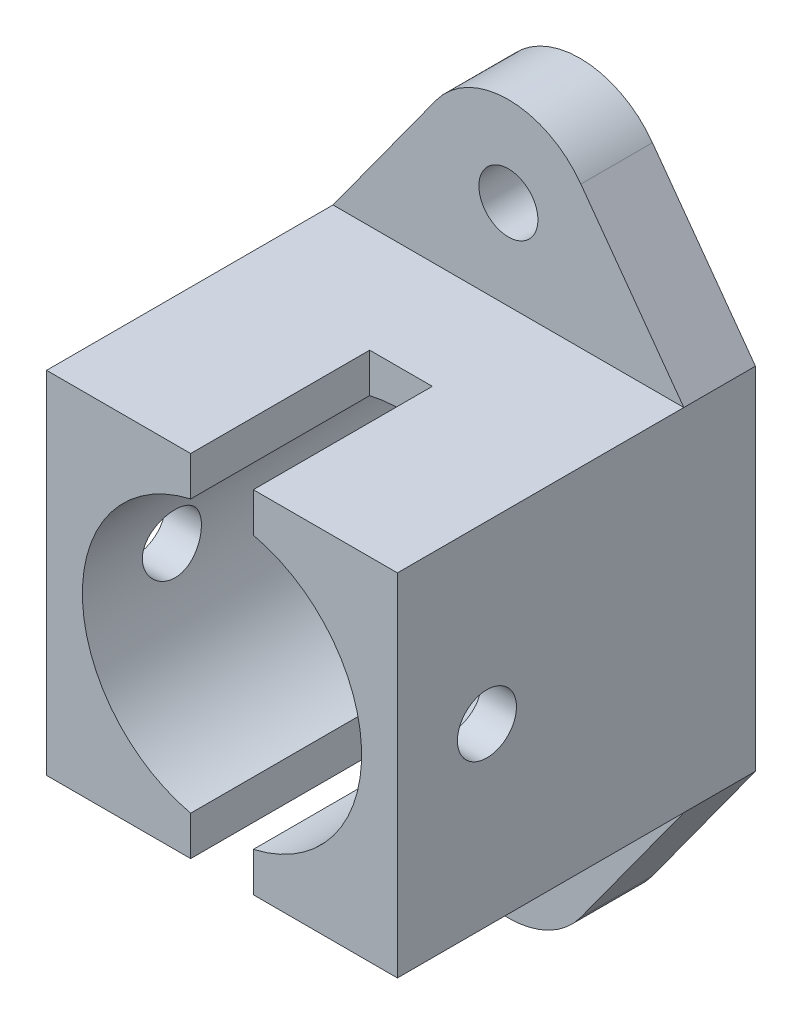
ISO-10303-21;
HEADER;
FILE_DESCRIPTION(('STEP AP214'),'2;1');
FILE_NAME('part.step','',(''),(''),'','','');
FILE_SCHEMA(('AUTOMOTIVE_DESIGN { 1 0 10303 214 1 1 1 1 }'));
ENDSEC;
DATA;
#1=APPLICATION_CONTEXT('core data for automotive mechanical design processes');
#2=APPLICATION_PROTOCOL_DEFINITION('international standard','automotive_design',2000,#1);
#3=PRODUCT_CONTEXT('',#1,'mechanical');
#4=PRODUCT('Part','Part','',(#3));
#5=PRODUCT_RELATED_PRODUCT_CATEGORY('part','',(#4));
#6=PRODUCT_DEFINITION_FORMATION('','',#4);
#7=PRODUCT_DEFINITION_CONTEXT('part definition',#1,'design');
#8=PRODUCT_DEFINITION('design','',#6,#7);
#9=PRODUCT_DEFINITION_SHAPE('','',#8);
#10=(LENGTH_UNIT() NAMED_UNIT(*) SI_UNIT(.MILLI.,.METRE.));
#11=(NAMED_UNIT(*) PLANE_ANGLE_UNIT() SI_UNIT($,.RADIAN.));
#12=(NAMED_UNIT(*) SI_UNIT($,.STERADIAN.) SOLID_ANGLE_UNIT());
#13=UNCERTAINTY_MEASURE_WITH_UNIT(LENGTH_MEASURE(1.E-05),#10,'distance_accuracy_value','');
#14=(GEOMETRIC_REPRESENTATION_CONTEXT(3) GLOBAL_UNCERTAINTY_ASSIGNED_CONTEXT((#13)) GLOBAL_UNIT_ASSIGNED_CONTEXT((#10,
#11,#12)) REPRESENTATION_CONTEXT('',''));
#15=CARTESIAN_POINT('',(0.,0.,0.));
#16=DIRECTION('',(0.,0.,1.));
#17=DIRECTION('',(1.,0.,0.));
#18=AXIS2_PLACEMENT_3D('',#15,#16,#17);
#19=CARTESIAN_POINT('',(0.,0.,20.));
#20=DIRECTION('',(0.,0.,-1.));
#21=DIRECTION('',(-1.,0.,0.));
#22=AXIS2_PLACEMENT_3D('',#19,#20,#21);
#23=PLANE('',#22);
#24=DIRECTION('',(1.,0.,0.));
#25=VECTOR('',#24,1.);
#26=CARTESIAN_POINT('',(-9.8,-9.8,20.));
#27=LINE('',#26,#25);
#28=CARTESIAN_POINT('',(-9.8,-9.8,20.));
#29=VERTEX_POINT('',#28);
#30=CARTESIAN_POINT('',(-1.75,-9.8,20.));
#31=VERTEX_POINT('',#30);
#32=EDGE_CURVE('E295',#29,#31,#27,.T.);
#33=ORIENTED_EDGE('',*,*,#32,.T.);
#34=DIRECTION('',(0.,-1.,0.));
#35=VECTOR('',#34,1.);
#36=CARTESIAN_POINT('',(-1.75,9.8,20.));
#37=LINE('',#36,#35);
#38=CARTESIAN_POINT('',(-1.75,-7.6011512285969,20.));
#39=VERTEX_POINT('',#38);
#40=EDGE_CURVE('E173',#39,#31,#37,.T.);
#41=ORIENTED_EDGE('',*,*,#40,.F.);
#42=CARTESIAN_POINT('',(0.,0.,20.));
#43=DIRECTION('',(0.,0.,1.));
#44=DIRECTION('',(1.,0.,0.));
#45=AXIS2_PLACEMENT_3D('',#42,#43,#44);
#46=CIRCLE('',#45,7.8);
#47=CARTESIAN_POINT('',(-1.75,7.60115122859688,20.));
#48=VERTEX_POINT('',#47);
#49=EDGE_CURVE('E281',#48,#39,#46,.T.);
#50=ORIENTED_EDGE('',*,*,#49,.F.);
#51=CARTESIAN_POINT('',(-1.75,9.8,20.));
#52=VERTEX_POINT('',#51);
#53=EDGE_CURVE('E187',#52,#48,#37,.T.);
#54=ORIENTED_EDGE('',*,*,#53,.F.);
#55=DIRECTION('',(-1.,0.,0.));
#56=VECTOR('',#55,1.);
#57=CARTESIAN_POINT('',(-9.8,9.8,20.));
#58=LINE('',#57,#56);
#59=CARTESIAN_POINT('',(-9.8,9.8,20.));
#60=VERTEX_POINT('',#59);
#61=EDGE_CURVE('E287',#52,#60,#58,.T.);
#62=ORIENTED_EDGE('',*,*,#61,.T.);
#63=DIRECTION('',(0.,-1.,0.));
#64=VECTOR('',#63,1.);
#65=CARTESIAN_POINT('',(-9.8,-9.8,20.));
#66=LINE('',#65,#64);
#67=EDGE_CURVE('E292',#60,#29,#66,.T.);
#68=ORIENTED_EDGE('',*,*,#67,.T.);
#69=EDGE_LOOP('',(#33,#41,#50,#54,#62,#68));
#70=FACE_BOUND('',#69,.T.);
#71=ADVANCED_FACE('F35',(#70),#23,.F.);
#72=CARTESIAN_POINT('',(9.8,9.8,20.));
#73=VERTEX_POINT('',#72);
#74=CARTESIAN_POINT('',(1.75,9.8,20.));
#75=VERTEX_POINT('',#74);
#76=EDGE_CURVE('E289',#73,#75,#58,.T.);
#77=ORIENTED_EDGE('',*,*,#76,.T.);
#78=DIRECTION('',(0.,1.,0.));
#79=VECTOR('',#78,1.);
#80=CARTESIAN_POINT('',(1.75,9.8,20.));
#81=LINE('',#80,#79);
#82=CARTESIAN_POINT('',(1.75,7.60115122859688,20.));
#83=VERTEX_POINT('',#82);
#84=EDGE_CURVE('E189',#83,#75,#81,.T.);
#85=ORIENTED_EDGE('',*,*,#84,.F.);
#86=CARTESIAN_POINT('',(1.75,-7.60115122859689,20.));
#87=VERTEX_POINT('',#86);
#88=EDGE_CURVE('E278',#87,#83,#46,.T.);
#89=ORIENTED_EDGE('',*,*,#88,.F.);
#90=CARTESIAN_POINT('',(1.75,-9.8,20.));
#91=VERTEX_POINT('',#90);
#92=EDGE_CURVE('E167',#91,#87,#81,.T.);
#93=ORIENTED_EDGE('',*,*,#92,.F.);
#94=CARTESIAN_POINT('',(9.8,-9.8,20.));
#95=VERTEX_POINT('',#94);
#96=EDGE_CURVE('E294',#91,#95,#27,.T.);
#97=ORIENTED_EDGE('',*,*,#96,.T.);
#98=DIRECTION('',(0.,1.,0.));
#99=VECTOR('',#98,1.);
#100=CARTESIAN_POINT('',(9.8,-9.8,20.));
#101=LINE('',#100,#99);
#102=EDGE_CURVE('E284',#95,#73,#101,.T.);
#103=ORIENTED_EDGE('',*,*,#102,.T.);
#104=EDGE_LOOP('',(#77,#85,#89,#93,#97,#103));
#105=FACE_BOUND('',#104,.T.);
#106=ADVANCED_FACE('F377',(#105),#23,.F.);
#107=CARTESIAN_POINT('',(0.,0.,0.));
#108=DIRECTION('',(0.,0.,-1.));
#109=DIRECTION('',(-1.,0.,0.));
#110=AXIS2_PLACEMENT_3D('',#107,#108,#109);
#111=PLANE('',#110);
#112=DIRECTION('',(0.,1.,0.));
#113=VECTOR('',#112,1.);
#114=CARTESIAN_POINT('',(9.8,-9.8,0.));
#115=LINE('',#114,#113);
#116=CARTESIAN_POINT('',(9.8,-9.8,0.));
#117=VERTEX_POINT('',#116);
#118=CARTESIAN_POINT('',(9.8,9.8,0.));
#119=VERTEX_POINT('',#118);
#120=EDGE_CURVE('E298',#117,#119,#115,.T.);
#121=ORIENTED_EDGE('',*,*,#120,.F.);
#122=DIRECTION('',(-0.586913417052214,-0.80964970257766,0.));
#123=VECTOR('',#122,1.);
#124=CARTESIAN_POINT('',(9.8,-9.8,0.));
#125=LINE('',#124,#123);
#126=CARTESIAN_POINT('',(4.0482485128883,-17.7345670852611,0.));
#127=VERTEX_POINT('',#126);
#128=EDGE_CURVE('E216',#117,#127,#125,.T.);
#129=ORIENTED_EDGE('',*,*,#128,.T.);
#130=CARTESIAN_POINT('',(0.,-14.8,0.));
#131=DIRECTION('',(0.,0.,-1.));
#132=DIRECTION('',(-1.,0.,0.));
#133=AXIS2_PLACEMENT_3D('',#130,#131,#132);
#134=CIRCLE('',#133,5.);
#135=CARTESIAN_POINT('',(-4.0482485128883,-17.7345670852611,0.));
#136=VERTEX_POINT('',#135);
#137=EDGE_CURVE('E207',#127,#136,#134,.T.);
#138=ORIENTED_EDGE('',*,*,#137,.T.);
#139=DIRECTION('',(-0.586913417052214,0.80964970257766,0.));
#140=VECTOR('',#139,1.);
#141=CARTESIAN_POINT('',(-4.0482485128883,-17.7345670852611,0.));
#142=LINE('',#141,#140);
#143=CARTESIAN_POINT('',(-9.8,-9.8,0.));
#144=VERTEX_POINT('',#143);
#145=EDGE_CURVE('E228',#136,#144,#142,.T.);
#146=ORIENTED_EDGE('',*,*,#145,.T.);
#147=DIRECTION('',(0.,-1.,0.));
#148=VECTOR('',#147,1.);
#149=CARTESIAN_POINT('',(-9.8,-9.8,0.));
#150=LINE('',#149,#148);
#151=CARTESIAN_POINT('',(-9.8,9.8,0.));
#152=VERTEX_POINT('',#151);
#153=EDGE_CURVE('E288',#152,#144,#150,.T.);
#154=ORIENTED_EDGE('',*,*,#153,.F.);
#155=DIRECTION('',(0.586913417052214,0.80964970257766,0.));
#156=VECTOR('',#155,1.);
#157=CARTESIAN_POINT('',(-4.0482485128883,17.7345670852611,0.));
#158=LINE('',#157,#156);
#159=CARTESIAN_POINT('',(-4.0482485128883,17.7345670852611,0.));
#160=VERTEX_POINT('',#159);
#161=EDGE_CURVE('E245',#152,#160,#158,.T.);
#162=ORIENTED_EDGE('',*,*,#161,.T.);
#163=CARTESIAN_POINT('',(0.,14.8,0.));
#164=DIRECTION('',(0.,0.,-1.));
#165=DIRECTION('',(1.,0.,0.));
#166=AXIS2_PLACEMENT_3D('',#163,#164,#165);
#167=CIRCLE('',#166,5.);
#168=CARTESIAN_POINT('',(4.0482485128883,17.7345670852611,0.));
#169=VERTEX_POINT('',#168);
#170=EDGE_CURVE('E264',#160,#169,#167,.T.);
#171=ORIENTED_EDGE('',*,*,#170,.T.);
#172=DIRECTION('',(0.586913417052214,-0.80964970257766,0.));
#173=VECTOR('',#172,1.);
#174=CARTESIAN_POINT('',(9.8,9.8,0.));
#175=LINE('',#174,#173);
#176=EDGE_CURVE('E252',#169,#119,#175,.T.);
#177=ORIENTED_EDGE('',*,*,#176,.T.);
#178=EDGE_LOOP('',(#121,#129,#138,#146,#154,#162,#171,#177));
#179=FACE_BOUND('',#178,.T.);
#180=CARTESIAN_POINT('',(0.,0.,0.));
#181=DIRECTION('',(0.,0.,1.));
#182=DIRECTION('',(1.,0.,0.));
#183=AXIS2_PLACEMENT_3D('',#180,#181,#182);
#184=CIRCLE('',#183,7.8);
#185=CARTESIAN_POINT('',(7.79999999999999,0.,0.));
#186=VERTEX_POINT('',#185);
#187=EDGE_CURVE('E271',#186,#186,#184,.T.);
#188=ORIENTED_EDGE('',*,*,#187,.T.);
#189=EDGE_LOOP('',(#188));
#190=FACE_BOUND('',#189,.T.);
#191=CARTESIAN_POINT('',(0.,14.8,0.));
#192=DIRECTION('',(0.,0.,-1.));
#193=DIRECTION('',(-1.,0.,0.));
#194=AXIS2_PLACEMENT_3D('',#191,#192,#193);
#195=CIRCLE('',#194,1.65);
#196=CARTESIAN_POINT('',(-1.65,14.8,0.));
#197=VERTEX_POINT('',#196);
#198=EDGE_CURVE('E235',#197,#197,#195,.T.);
#199=ORIENTED_EDGE('',*,*,#198,.F.);
#200=EDGE_LOOP('',(#199));
#201=FACE_BOUND('',#200,.T.);
#202=CARTESIAN_POINT('',(0.,-14.8,0.));
#203=DIRECTION('',(0.,0.,-1.));
#204=DIRECTION('',(1.,0.,0.));
#205=AXIS2_PLACEMENT_3D('',#202,#203,#204);
#206=CIRCLE('',#205,1.65);
#207=CARTESIAN_POINT('',(1.65,-14.8,0.));
#208=VERTEX_POINT('',#207);
#209=EDGE_CURVE('E208',#208,#208,#206,.T.);
#210=ORIENTED_EDGE('',*,*,#209,.F.);
#211=EDGE_LOOP('',(#210));
#212=FACE_BOUND('',#211,.T.);
#213=ADVANCED_FACE('F382',(#179,#190,#201,#212),#111,.T.);
#214=CARTESIAN_POINT('',(9.8,-9.8,20.));
#215=DIRECTION('',(-1.,0.,0.));
#216=DIRECTION('',(0.,0.,1.));
#217=AXIS2_PLACEMENT_3D('',#214,#215,#216);
#218=PLANE('',#217);
#219=CARTESIAN_POINT('',(9.8,0.,15.));
#220=DIRECTION('',(1.,0.,0.));
#221=DIRECTION('',(0.,0.,-1.));
#222=AXIS2_PLACEMENT_3D('',#219,#220,#221);
#223=CIRCLE('',#222,1.65);
#224=CARTESIAN_POINT('',(9.8,0.,13.35));
#225=VERTEX_POINT('',#224);
#226=EDGE_CURVE('E193',#225,#225,#223,.T.);
#227=ORIENTED_EDGE('',*,*,#226,.F.);
#228=EDGE_LOOP('',(#227));
#229=FACE_BOUND('',#228,.T.);
#230=ORIENTED_EDGE('',*,*,#120,.T.);
#231=DIRECTION('',(0.,0.,-1.));
#232=VECTOR('',#231,1.);
#233=CARTESIAN_POINT('',(9.8,9.8,4.));
#234=LINE('',#233,#232);
#235=CARTESIAN_POINT('',(9.8,9.8,4.));
#236=VERTEX_POINT('',#235);
#237=EDGE_CURVE('E269',#236,#119,#234,.T.);
#238=ORIENTED_EDGE('',*,*,#237,.F.);
#239=DIRECTION('',(0.,0.,-1.));
#240=VECTOR('',#239,1.);
#241=CARTESIAN_POINT('',(9.8,9.8,20.));
#242=LINE('',#241,#240);
#243=EDGE_CURVE('E311',#73,#236,#242,.T.);
#244=ORIENTED_EDGE('',*,*,#243,.F.);
#245=ORIENTED_EDGE('',*,*,#102,.F.);
#246=DIRECTION('',(0.,0.,-1.));
#247=VECTOR('',#246,1.);
#248=CARTESIAN_POINT('',(9.8,-9.8,20.));
#249=LINE('',#248,#247);
#250=CARTESIAN_POINT('',(9.8,-9.8,4.));
#251=VERTEX_POINT('',#250);
#252=EDGE_CURVE('E297',#95,#251,#249,.T.);
#253=ORIENTED_EDGE('',*,*,#252,.T.);
#254=DIRECTION('',(0.,0.,-1.));
#255=VECTOR('',#254,1.);
#256=CARTESIAN_POINT('',(9.8,-9.8,4.));
#257=LINE('',#256,#255);
#258=EDGE_CURVE('E236',#251,#117,#257,.T.);
#259=ORIENTED_EDGE('',*,*,#258,.T.);
#260=EDGE_LOOP('',(#230,#238,#244,#245,#253,#259));
#261=FACE_BOUND('',#260,.T.);
#262=ADVANCED_FACE('F37',(#229,#261),#218,.F.);
#263=CARTESIAN_POINT('',(-9.8,9.8,20.));
#264=DIRECTION('',(0.,-1.,0.));
#265=DIRECTION('',(0.,0.,-1.));
#266=AXIS2_PLACEMENT_3D('',#263,#264,#265);
#267=PLANE('',#266);
#268=ORIENTED_EDGE('',*,*,#61,.F.);
#269=DIRECTION('',(0.,0.,1.));
#270=VECTOR('',#269,1.);
#271=CARTESIAN_POINT('',(-1.75,9.8,10.));
#272=LINE('',#271,#270);
#273=CARTESIAN_POINT('',(-1.75,9.8,10.));
#274=VERTEX_POINT('',#273);
#275=EDGE_CURVE('E191',#274,#52,#272,.T.);
#276=ORIENTED_EDGE('',*,*,#275,.F.);
#277=DIRECTION('',(-1.,0.,0.));
#278=VECTOR('',#277,1.);
#279=CARTESIAN_POINT('',(-1.75,9.8,10.));
#280=LINE('',#279,#278);
#281=CARTESIAN_POINT('',(1.75,9.8,10.));
#282=VERTEX_POINT('',#281);
#283=EDGE_CURVE('E178',#282,#274,#280,.T.);
#284=ORIENTED_EDGE('',*,*,#283,.F.);
#285=DIRECTION('',(0.,0.,1.));
#286=VECTOR('',#285,1.);
#287=CARTESIAN_POINT('',(1.75,9.8,10.));
#288=LINE('',#287,#286);
#289=EDGE_CURVE('E194',#282,#75,#288,.T.);
#290=ORIENTED_EDGE('',*,*,#289,.T.);
#291=ORIENTED_EDGE('',*,*,#76,.F.);
#292=ORIENTED_EDGE('',*,*,#243,.T.);
#293=DIRECTION('',(-1.,0.,0.));
#294=VECTOR('',#293,1.);
#295=CARTESIAN_POINT('',(9.8,9.8,4.));
#296=LINE('',#295,#294);
#297=CARTESIAN_POINT('',(-9.8,9.8,4.));
#298=VERTEX_POINT('',#297);
#299=EDGE_CURVE('E248',#236,#298,#296,.T.);
#300=ORIENTED_EDGE('',*,*,#299,.T.);
#301=DIRECTION('',(0.,0.,-1.));
#302=VECTOR('',#301,1.);
#303=CARTESIAN_POINT('',(-9.8,9.8,20.));
#304=LINE('',#303,#302);
#305=EDGE_CURVE('E308',#60,#298,#304,.T.);
#306=ORIENTED_EDGE('',*,*,#305,.F.);
#307=EDGE_LOOP('',(#268,#276,#284,#290,#291,#292,#300,#306));
#308=FACE_BOUND('',#307,.T.);
#309=ADVANCED_FACE('F392',(#308),#267,.F.);
#310=CARTESIAN_POINT('',(-9.8,-9.8,20.));
#311=DIRECTION('',(1.,0.,0.));
#312=DIRECTION('',(0.,0.,-1.));
#313=AXIS2_PLACEMENT_3D('',#310,#311,#312);
#314=PLANE('',#313);
#315=CARTESIAN_POINT('',(-9.8,0.,15.));
#316=DIRECTION('',(1.,0.,0.));
#317=DIRECTION('',(0.,0.,-1.));
#318=AXIS2_PLACEMENT_3D('',#315,#316,#317);
#319=CIRCLE('',#318,1.65);
#320=CARTESIAN_POINT('',(-9.8,0.,13.35));
#321=VERTEX_POINT('',#320);
#322=EDGE_CURVE('E198',#321,#321,#319,.T.);
#323=ORIENTED_EDGE('',*,*,#322,.T.);
#324=EDGE_LOOP('',(#323));
#325=FACE_BOUND('',#324,.T.);
#326=ORIENTED_EDGE('',*,*,#153,.T.);
#327=DIRECTION('',(0.,0.,-1.));
#328=VECTOR('',#327,1.);
#329=CARTESIAN_POINT('',(-9.8,-9.8,4.));
#330=LINE('',#329,#328);
#331=CARTESIAN_POINT('',(-9.8,-9.8,4.));
#332=VERTEX_POINT('',#331);
#333=EDGE_CURVE('E239',#332,#144,#330,.T.);
#334=ORIENTED_EDGE('',*,*,#333,.F.);
#335=DIRECTION('',(0.,0.,-1.));
#336=VECTOR('',#335,1.);
#337=CARTESIAN_POINT('',(-9.8,-9.8,20.));
#338=LINE('',#337,#336);
#339=EDGE_CURVE('E305',#29,#332,#338,.T.);
#340=ORIENTED_EDGE('',*,*,#339,.F.);
#341=ORIENTED_EDGE('',*,*,#67,.F.);
#342=ORIENTED_EDGE('',*,*,#305,.T.);
#343=DIRECTION('',(0.,0.,-1.));
#344=VECTOR('',#343,1.);
#345=CARTESIAN_POINT('',(-9.8,9.8,4.));
#346=LINE('',#345,#344);
#347=EDGE_CURVE('E261',#298,#152,#346,.T.);
#348=ORIENTED_EDGE('',*,*,#347,.T.);
#349=EDGE_LOOP('',(#326,#334,#340,#341,#342,#348));
#350=FACE_BOUND('',#349,.T.);
#351=ADVANCED_FACE('F390',(#325,#350),#314,.F.);
#352=CARTESIAN_POINT('',(-9.8,-9.8,20.));
#353=DIRECTION('',(0.,1.,0.));
#354=DIRECTION('',(0.,0.,1.));
#355=AXIS2_PLACEMENT_3D('',#352,#353,#354);
#356=PLANE('',#355);
#357=DIRECTION('',(1.,0.,0.));
#358=VECTOR('',#357,1.);
#359=CARTESIAN_POINT('',(-1.75,-9.8,10.));
#360=LINE('',#359,#358);
#361=CARTESIAN_POINT('',(-1.75,-9.8,10.));
#362=VERTEX_POINT('',#361);
#363=CARTESIAN_POINT('',(1.75,-9.8,10.));
#364=VERTEX_POINT('',#363);
#365=EDGE_CURVE('E161',#362,#364,#360,.T.);
#366=ORIENTED_EDGE('',*,*,#365,.F.);
#367=DIRECTION('',(0.,0.,1.));
#368=VECTOR('',#367,1.);
#369=CARTESIAN_POINT('',(-1.75,-9.8,10.));
#370=LINE('',#369,#368);
#371=EDGE_CURVE('E170',#362,#31,#370,.T.);
#372=ORIENTED_EDGE('',*,*,#371,.T.);
#373=ORIENTED_EDGE('',*,*,#32,.F.);
#374=ORIENTED_EDGE('',*,*,#339,.T.);
#375=DIRECTION('',(1.,0.,0.));
#376=VECTOR('',#375,1.);
#377=CARTESIAN_POINT('',(9.8,-9.8,4.));
#378=LINE('',#377,#376);
#379=EDGE_CURVE('E219',#332,#251,#378,.T.);
#380=ORIENTED_EDGE('',*,*,#379,.T.);
#381=ORIENTED_EDGE('',*,*,#252,.F.);
#382=ORIENTED_EDGE('',*,*,#96,.F.);
#383=DIRECTION('',(0.,0.,1.));
#384=VECTOR('',#383,1.);
#385=CARTESIAN_POINT('',(1.75,-9.8,10.));
#386=LINE('',#385,#384);
#387=EDGE_CURVE('E177',#364,#91,#386,.T.);
#388=ORIENTED_EDGE('',*,*,#387,.F.);
#389=EDGE_LOOP('',(#366,#372,#373,#374,#380,#381,#382,#388));
#390=FACE_BOUND('',#389,.T.);
#391=ADVANCED_FACE('F180',(#390),#356,.F.);
#392=CARTESIAN_POINT('',(0.,0.,20.));
#393=DIRECTION('',(0.,0.,-1.));
#394=DIRECTION('',(-1.,0.,0.));
#395=AXIS2_PLACEMENT_3D('',#392,#393,#394);
#396=CYLINDRICAL_SURFACE('',#395,7.8);
#397=DIRECTION('',(0.,0.,-1.));
#398=VECTOR('',#397,1.);
#399=CARTESIAN_POINT('',(-1.75,7.60115122859688,20.));
#400=LINE('',#399,#398);
#401=CARTESIAN_POINT('',(-1.75,7.60115122859688,10.));
#402=VERTEX_POINT('',#401);
#403=EDGE_CURVE('E11',#48,#402,#400,.T.);
#404=ORIENTED_EDGE('',*,*,#403,.F.);
#405=ORIENTED_EDGE('',*,*,#49,.T.);
#406=DIRECTION('',(0.,0.,-1.));
#407=VECTOR('',#406,1.);
#408=CARTESIAN_POINT('',(-1.75,-7.6011512285969,20.));
#409=LINE('',#408,#407);
#410=CARTESIAN_POINT('',(-1.75,-7.6011512285969,10.));
#411=VERTEX_POINT('',#410);
#412=EDGE_CURVE('E418',#411,#39,#409,.F.);
#413=ORIENTED_EDGE('',*,*,#412,.F.);
#414=CARTESIAN_POINT('',(0.,0.,10.));
#415=DIRECTION('',(0.,0.,1.));
#416=DIRECTION('',(1.,0.,0.));
#417=AXIS2_PLACEMENT_3D('',#414,#415,#416);
#418=CIRCLE('',#417,7.8);
#419=CARTESIAN_POINT('',(1.75,-7.60115122859689,10.));
#420=VERTEX_POINT('',#419);
#421=EDGE_CURVE('E164',#411,#420,#418,.T.);
#422=ORIENTED_EDGE('',*,*,#421,.T.);
#423=DIRECTION('',(0.,0.,-1.));
#424=VECTOR('',#423,1.);
#425=CARTESIAN_POINT('',(1.75,-7.60115122859689,20.));
#426=LINE('',#425,#424);
#427=EDGE_CURVE('E419',#87,#420,#426,.T.);
#428=ORIENTED_EDGE('',*,*,#427,.F.);
#429=ORIENTED_EDGE('',*,*,#88,.T.);
#430=DIRECTION('',(0.,0.,-1.));
#431=VECTOR('',#430,1.);
#432=CARTESIAN_POINT('',(1.75,7.60115122859688,20.));
#433=LINE('',#432,#431);
#434=CARTESIAN_POINT('',(1.75,7.60115122859688,10.));
#435=VERTEX_POINT('',#434);
#436=EDGE_CURVE('E43',#435,#83,#433,.F.);
#437=ORIENTED_EDGE('',*,*,#436,.F.);
#438=EDGE_CURVE('E416',#435,#402,#418,.T.);
#439=ORIENTED_EDGE('',*,*,#438,.T.);
#440=EDGE_LOOP('',(#404,#405,#413,#422,#428,#429,#437,#439));
#441=FACE_BOUND('',#440,.T.);
#442=CARTESIAN_POINT('',(-7.80000000000001,0.,16.65));
#443=CARTESIAN_POINT('',(-7.79999830469436,-0.0915875772465286,16.6499967724506));
#444=CARTESIAN_POINT('',(-7.79837041111617,-0.183214848955862,16.6423485323528));
#445=CARTESIAN_POINT('',(-7.79203356953683,-0.363871751180327,16.6119864637981));
#446=CARTESIAN_POINT('',(-7.78732232301474,-0.452899392010177,16.5892613959731));
#447=CARTESIAN_POINT('',(-7.77534393504957,-0.625719605148227,16.5294853186404));
#448=CARTESIAN_POINT('',(-7.76807937730729,-0.709517369015825,16.4924487871796));
#449=CARTESIAN_POINT('',(-7.75178064604928,-0.869705495245335,16.4051459299638));
#450=CARTESIAN_POINT('',(-7.74274654159474,-0.946096146515239,16.3548801204895));
#451=CARTESIAN_POINT('',(-7.72374804887737,-1.09045639072774,16.2417436992409));
#452=CARTESIAN_POINT('',(-7.71377274905055,-1.15829838943425,16.1787120967196));
#453=CARTESIAN_POINT('',(-7.69409400277973,-1.28252978219285,16.0421791290617));
#454=CARTESIAN_POINT('',(-7.68439057941179,-1.33891820662389,15.9686768784106));
#455=CARTESIAN_POINT('',(-7.66624708678558,-1.43919692819092,15.8123557329739));
#456=CARTESIAN_POINT('',(-7.65782102300633,-1.48295285316709,15.7294488693393));
#457=CARTESIAN_POINT('',(-7.64334227107924,-1.55586301145797,15.5572516169688));
#458=CARTESIAN_POINT('',(-7.63728931877794,-1.58501887002113,15.4679619400193));
#459=CARTESIAN_POINT('',(-7.62835298218938,-1.62748250774906,15.2869133954173));
#460=CARTESIAN_POINT('',(-7.62542462261817,-1.64101540309082,15.1952095937012));
#461=CARTESIAN_POINT('',(-7.62293384221555,-1.65254864819576,15.0107900192184));
#462=CARTESIAN_POINT('',(-7.62337103524915,-1.65055077982685,14.9180743637619));
#463=CARTESIAN_POINT('',(-7.6275211871781,-1.63126070344878,14.7359259589709));
#464=CARTESIAN_POINT('',(-7.63117842538225,-1.61422863926636,14.6464641988491));
#465=CARTESIAN_POINT('',(-7.64126863518045,-1.56576519678073,14.4716972655634));
#466=CARTESIAN_POINT('',(-7.64770175343093,-1.53433305768144,14.3863923122787));
#467=CARTESIAN_POINT('',(-7.66267459133265,-1.45771910561899,14.2216219386076));
#468=CARTESIAN_POINT('',(-7.67122973112014,-1.41243605383393,14.1422050511105));
#469=CARTESIAN_POINT('',(-7.68947303471958,-1.30947697591014,13.9920003570125));
#470=CARTESIAN_POINT('',(-7.69916134340986,-1.25179936430651,13.9212136561695));
#471=CARTESIAN_POINT('',(-7.71881935083462,-1.12430513495703,13.7887796335709));
#472=CARTESIAN_POINT('',(-7.72879078194811,-1.05426697953826,13.7273456453741));
#473=CARTESIAN_POINT('',(-7.74771302196341,-0.90477105211873,13.6170621437388));
#474=CARTESIAN_POINT('',(-7.75666381462033,-0.825313130230072,13.5682128305878));
#475=CARTESIAN_POINT('',(-7.77256243307013,-0.658982035735617,13.4844378712619));
#476=CARTESIAN_POINT('',(-7.7795064331133,-0.572095103602879,13.449538771898));
#477=CARTESIAN_POINT('',(-7.79058041750596,-0.393511166160903,13.3948939997663));
#478=CARTESIAN_POINT('',(-7.79471078404144,-0.301814815955386,13.3751462688875));
#479=CARTESIAN_POINT('',(-7.79963818366937,-0.118046184527316,13.3516718318374));
#480=CARTESIAN_POINT('',(-7.80049588427714,-0.0260127338586504,13.347653502822));
#481=CARTESIAN_POINT('',(-7.79895072946928,0.157410393711004,13.3549634962044));
#482=CARTESIAN_POINT('',(-7.79654808020061,0.248800110947033,13.366290848318));
#483=CARTESIAN_POINT('',(-7.78879034886025,0.427385330773665,13.4037286437105));
#484=CARTESIAN_POINT('',(-7.78346556829864,0.514614057008098,13.4296874374892));
#485=CARTESIAN_POINT('',(-7.77045904975007,0.683479836868893,13.4954839458635));
#486=CARTESIAN_POINT('',(-7.76277712014692,0.765116435242551,13.5353227888251));
#487=CARTESIAN_POINT('',(-7.74575811935192,0.921695952139185,13.6283652632514));
#488=CARTESIAN_POINT('',(-7.73640012348093,0.996533748772014,13.6817418915065));
#489=CARTESIAN_POINT('',(-7.71711217481368,1.13629480757768,13.8001154696256));
#490=CARTESIAN_POINT('',(-7.70718215296253,1.20121686925558,13.8651138244637));
#491=CARTESIAN_POINT('',(-7.68766175091592,1.3204457821075,14.0062199522255));
#492=CARTESIAN_POINT('',(-7.67808012311302,1.37455135722072,14.0824992241831));
#493=CARTESIAN_POINT('',(-7.66053682319392,1.46918389430498,14.2432338259716));
#494=CARTESIAN_POINT('',(-7.65257508273932,1.50971142914132,14.3276888106707));
#495=CARTESIAN_POINT('',(-7.63924574670512,1.57577324409488,14.5019332102876));
#496=CARTESIAN_POINT('',(-7.63386398457403,1.60138957135925,14.5916903819247));
#497=CARTESIAN_POINT('',(-7.62627653919677,1.63714578002419,14.7743626339548));
#498=CARTESIAN_POINT('',(-7.62407038552597,1.64728795373051,14.867277244527));
#499=CARTESIAN_POINT('',(-7.62311221583649,1.65171534854803,15.0516009534173));
#500=CARTESIAN_POINT('',(-7.62429077944625,1.64631925266786,15.1430021822544));
#501=CARTESIAN_POINT('',(-7.62981299606523,1.62053214101549,15.3235618236428));
#502=CARTESIAN_POINT('',(-7.63415661665126,1.60014127885133,15.4127202591599));
#503=CARTESIAN_POINT('',(-7.64548677864128,1.54509285618838,15.5860301110294));
#504=CARTESIAN_POINT('',(-7.65246525409313,1.51047880816028,15.6701959102518));
#505=CARTESIAN_POINT('',(-7.66828252465957,1.42800507093742,15.8315738765944));
#506=CARTESIAN_POINT('',(-7.67712149893864,1.38014410593572,15.9087853729978));
#507=CARTESIAN_POINT('',(-7.69587319870477,1.27146574066639,16.055640282313));
#508=CARTESIAN_POINT('',(-7.70580309685434,1.21042001538793,16.1251125649225));
#509=CARTESIAN_POINT('',(-7.72549937941115,1.07757121752033,16.2529320348473));
#510=CARTESIAN_POINT('',(-7.73526572560898,1.00576566912091,16.3112766546726));
#511=CARTESIAN_POINT('',(-7.75367279080614,0.852401257689931,16.4158494719713));
#512=CARTESIAN_POINT('',(-7.76229864586871,0.770735989938275,16.4619243671717));
#513=CARTESIAN_POINT('',(-7.77730492886996,0.600657750393031,16.5396217727588));
#514=CARTESIAN_POINT('',(-7.78368729472831,0.512250682889434,16.5712567633823));
#515=CARTESIAN_POINT('',(-7.79230860229573,0.353091971393748,16.6133445538363));
#516=CARTESIAN_POINT('',(-7.79517540373878,0.283219877103824,16.6270648069504));
#517=CARTESIAN_POINT('',(-7.79902172403436,0.142239804050111,16.6453936052755));
#518=CARTESIAN_POINT('',(-7.8000013166662,0.0711318737102733,16.6500025066897));
#519=CARTESIAN_POINT('',(-7.80000000000001,0.,16.65));
#520=B_SPLINE_CURVE_WITH_KNOTS('',3,(#442,#443,#444,#445,#446,#447,#448,#449,#450,#451,#452,
#453,#454,#455,#456,#457,#458,#459,#460,#461,#462,#463,#464,#465,#466,#467,#468,#469,#470,#471,
#472,#473,#474,#475,#476,#477,#478,#479,#480,#481,#482,#483,#484,#485,#486,#487,#488,#489,#490,
#491,#492,#493,#494,#495,#496,#497,#498,#499,#500,#501,#502,#503,#504,#505,#506,#507,#508,#509,
#510,#511,#512,#513,#514,#515,#516,#517,#518,#519),.UNSPECIFIED.,.T.,.F.,(4,2,2,2,2,2,2,2,2,2,2,
2,2,2,2,2,2,2,2,2,2,2,2,2,2,2,2,2,2,2,2,2,2,2,2,2,2,2,4),(0.,0.274502420279176,
0.549209704986777,0.823639809358961,1.09805920551405,1.37618294292273,1.65433021554706,
1.93533546481344,2.21630942621357,2.49318212178123,2.77002305179646,3.04216556710352,
3.31432246211637,3.58851816296961,3.86274895879302,4.14251542935339,4.42228635217226,
4.70258716412341,4.98284989420761,5.25789123547928,5.53291518711522,5.80513969256453,
6.0773863334192,6.35330459947409,6.62925624443239,6.90994325688971,7.19061842550914,
7.46973424638442,7.74880871566383,8.02220051163379,8.29558950698675,8.5681482876805,
8.8407333275756,9.11848354952293,9.39629777956699,9.67743557561772,9.9583299253975,
10.1715317097147,10.3847251588646),.UNSPECIFIED.);
#521=CARTESIAN_POINT('',(-7.80000000000001,0.,16.65));
#522=VERTEX_POINT('',#521);
#523=EDGE_CURVE('E211',#522,#522,#520,.T.);
#524=ORIENTED_EDGE('',*,*,#523,.F.);
#525=EDGE_LOOP('',(#524));
#526=FACE_BOUND('',#525,.T.);
#527=CARTESIAN_POINT('',(7.79999999999999,0.,13.35));
#528=CARTESIAN_POINT('',(7.79999830469435,-0.0915875772465234,13.3500032275493));
#529=CARTESIAN_POINT('',(7.79837041111616,-0.183214848955857,13.3576514676472));
#530=CARTESIAN_POINT('',(7.79203356953682,-0.363871751180322,13.3880135362019));
#531=CARTESIAN_POINT('',(7.78732232301473,-0.452899392010172,13.4107386040269));
#532=CARTESIAN_POINT('',(7.77534393504956,-0.625719605148222,13.4705146813596));
#533=CARTESIAN_POINT('',(7.76807937730728,-0.70951736901582,13.5075512128204));
#534=CARTESIAN_POINT('',(7.75178064604927,-0.869705495245331,13.5948540700362));
#535=CARTESIAN_POINT('',(7.74274654159473,-0.946096146515235,13.6451198795105));
#536=CARTESIAN_POINT('',(7.72374804887736,-1.09045639072774,13.7582563007591));
#537=CARTESIAN_POINT('',(7.71377274905054,-1.15829838943424,13.8212879032804));
#538=CARTESIAN_POINT('',(7.69409400277972,-1.28252978219285,13.9578208709383));
#539=CARTESIAN_POINT('',(7.68439057941178,-1.33891820662388,14.0313231215894));
#540=CARTESIAN_POINT('',(7.66624708678557,-1.43919692819092,14.1876442670261));
#541=CARTESIAN_POINT('',(7.65782102300633,-1.48295285316709,14.2705511306607));
#542=CARTESIAN_POINT('',(7.64334227107923,-1.55586301145797,14.4427483830312));
#543=CARTESIAN_POINT('',(7.63728931877793,-1.58501887002112,14.5320380599807));
#544=CARTESIAN_POINT('',(7.62835298218937,-1.62748250774906,14.7130866045827));
#545=CARTESIAN_POINT('',(7.62542462261816,-1.64101540309082,14.8047904062988));
#546=CARTESIAN_POINT('',(7.62293384221553,-1.65254864819576,14.9892099807816));
#547=CARTESIAN_POINT('',(7.62337103524914,-1.65055077982685,15.0819256362381));
#548=CARTESIAN_POINT('',(7.62752118717809,-1.63126070344878,15.2640740410291));
#549=CARTESIAN_POINT('',(7.63117842538224,-1.61422863926637,15.3535358011509));
#550=CARTESIAN_POINT('',(7.64126863518044,-1.56576519678073,15.5283027344366));
#551=CARTESIAN_POINT('',(7.64770175343092,-1.53433305768144,15.6136076877213));
#552=CARTESIAN_POINT('',(7.66267459133264,-1.45771910561899,15.7783780613924));
#553=CARTESIAN_POINT('',(7.67122973112013,-1.41243605383393,15.8577949488895));
#554=CARTESIAN_POINT('',(7.68947303471958,-1.30947697591014,16.0079996429875));
#555=CARTESIAN_POINT('',(7.69916134340985,-1.25179936430651,16.0787863438305));
#556=CARTESIAN_POINT('',(7.71881935083461,-1.12430513495703,16.2112203664291));
#557=CARTESIAN_POINT('',(7.72879078194809,-1.05426697953827,16.2726543546259));
#558=CARTESIAN_POINT('',(7.7477130219634,-0.904771052118733,16.3829378562612));
#559=CARTESIAN_POINT('',(7.75666381462032,-0.825313130230077,16.4317871694122));
#560=CARTESIAN_POINT('',(7.77256243307012,-0.658982035735624,16.5155621287381));
#561=CARTESIAN_POINT('',(7.77950643311329,-0.572095103602885,16.550461228102));
#562=CARTESIAN_POINT('',(7.79058041750595,-0.393511166160909,16.6051060002337));
#563=CARTESIAN_POINT('',(7.79471078404143,-0.301814815955392,16.6248537311125));
#564=CARTESIAN_POINT('',(7.79963818366936,-0.118046184527322,16.6483281681626));
#565=CARTESIAN_POINT('',(7.80049588427713,-0.0260127338586571,16.652346497178));
#566=CARTESIAN_POINT('',(7.79895072946927,0.157410393710998,16.6450365037956));
#567=CARTESIAN_POINT('',(7.7965480802006,0.248800110947027,16.633709151682));
#568=CARTESIAN_POINT('',(7.78879034886024,0.427385330773659,16.5962713562895));
#569=CARTESIAN_POINT('',(7.78346556829863,0.514614057008091,16.5703125625108));
#570=CARTESIAN_POINT('',(7.77045904975006,0.683479836868887,16.5045160541365));
#571=CARTESIAN_POINT('',(7.76277712014691,0.765116435242545,16.4646772111749));
#572=CARTESIAN_POINT('',(7.74575811935191,0.92169595213918,16.3716347367486));
#573=CARTESIAN_POINT('',(7.73640012348092,0.99653374877201,16.3182581084935));
#574=CARTESIAN_POINT('',(7.71711217481367,1.13629480757768,16.1998845303744));
#575=CARTESIAN_POINT('',(7.70718215296252,1.20121686925558,16.1348861755363));
#576=CARTESIAN_POINT('',(7.68766175091591,1.32044578210749,15.9937800477745));
#577=CARTESIAN_POINT('',(7.67808012311301,1.37455135722072,15.9175007758169));
#578=CARTESIAN_POINT('',(7.66053682319391,1.46918389430497,15.7567661740284));
#579=CARTESIAN_POINT('',(7.65257508273931,1.50971142914132,15.6723111893293));
#580=CARTESIAN_POINT('',(7.63924574670511,1.57577324409488,15.4980667897124));
#581=CARTESIAN_POINT('',(7.63386398457402,1.60138957135924,15.4083096180753));
#582=CARTESIAN_POINT('',(7.62627653919676,1.63714578002419,15.2256373660452));
#583=CARTESIAN_POINT('',(7.62407038552596,1.64728795373051,15.132722755473));
#584=CARTESIAN_POINT('',(7.62311221583648,1.65171534854803,14.9483990465827));
#585=CARTESIAN_POINT('',(7.62429077944624,1.64631925266786,14.8569978177456));
#586=CARTESIAN_POINT('',(7.62981299606522,1.62053214101549,14.6764381763572));
#587=CARTESIAN_POINT('',(7.63415661665125,1.60014127885133,14.5872797408401));
#588=CARTESIAN_POINT('',(7.64548677864126,1.54509285618839,14.4139698889706));
#589=CARTESIAN_POINT('',(7.65246525409312,1.51047880816028,14.3298040897482));
#590=CARTESIAN_POINT('',(7.66828252465956,1.42800507093742,14.1684261234056));
#591=CARTESIAN_POINT('',(7.67712149893863,1.38014410593572,14.0912146270022));
#592=CARTESIAN_POINT('',(7.69587319870476,1.27146574066639,13.944359717687));
#593=CARTESIAN_POINT('',(7.70580309685432,1.21042001538793,13.8748874350775));
#594=CARTESIAN_POINT('',(7.72549937941114,1.07757121752033,13.7470679651527));
#595=CARTESIAN_POINT('',(7.73526572560897,1.00576566912092,13.6887233453274));
#596=CARTESIAN_POINT('',(7.75367279080613,0.852401257689938,13.5841505280287));
#597=CARTESIAN_POINT('',(7.76229864586869,0.770735989938281,13.5380756328283));
#598=CARTESIAN_POINT('',(7.77730492886995,0.600657750393037,13.4603782272412));
#599=CARTESIAN_POINT('',(7.7836872947283,0.512250682889442,13.4287432366177));
#600=CARTESIAN_POINT('',(7.79230860229572,0.353091971393755,13.3866554461637));
#601=CARTESIAN_POINT('',(7.79517540373877,0.283219877103831,13.3729351930496));
#602=CARTESIAN_POINT('',(7.79902172403435,0.142239804050117,13.3546063947245));
#603=CARTESIAN_POINT('',(7.80000131666619,0.0711318737102788,13.3499974933103));
#604=CARTESIAN_POINT('',(7.79999999999999,0.,13.35));
#605=B_SPLINE_CURVE_WITH_KNOTS('',3,(#527,#528,#529,#530,#531,#532,#533,#534,#535,#536,#537,
#538,#539,#540,#541,#542,#543,#544,#545,#546,#547,#548,#549,#550,#551,#552,#553,#554,#555,#556,
#557,#558,#559,#560,#561,#562,#563,#564,#565,#566,#567,#568,#569,#570,#571,#572,#573,#574,#575,
#576,#577,#578,#579,#580,#581,#582,#583,#584,#585,#586,#587,#588,#589,#590,#591,#592,#593,#594,
#595,#596,#597,#598,#599,#600,#601,#602,#603,#604),.UNSPECIFIED.,.T.,.F.,(4,2,2,2,2,2,2,2,2,2,2,
2,2,2,2,2,2,2,2,2,2,2,2,2,2,2,2,2,2,2,2,2,2,2,2,2,2,2,4),(0.,0.274502420279176,
0.549209704986777,0.823639809358961,1.09805920551405,1.37618294292273,1.65433021554706,
1.93533546481344,2.21630942621356,2.49318212178123,2.77002305179646,3.04216556710352,
3.31432246211637,3.58851816296961,3.86274895879302,4.14251542935339,4.42228635217226,
4.70258716412341,4.9828498942076,5.25789123547928,5.53291518711522,5.80513969256452,
6.0773863334192,6.35330459947409,6.62925624443239,6.9099432568897,7.19061842550913,
7.46973424638442,7.74880871566383,8.02220051163379,8.29558950698675,8.5681482876805,
8.84073332757559,9.11848354952293,9.39629777956699,9.67743557561771,9.9583299253975,
10.1715317097147,10.3847251588646),.UNSPECIFIED.);
#606=CARTESIAN_POINT('',(7.79999999999999,0.,13.35));
#607=VERTEX_POINT('',#606);
#608=EDGE_CURVE('E201',#607,#607,#605,.T.);
#609=ORIENTED_EDGE('',*,*,#608,.F.);
#610=EDGE_LOOP('',(#609));
#611=FACE_BOUND('',#610,.T.);
#612=ORIENTED_EDGE('',*,*,#187,.F.);
#613=EDGE_LOOP('',(#612));
#614=FACE_BOUND('',#613,.T.);
#615=ADVANCED_FACE('F323',(#441,#526,#611,#614),#396,.F.);
#616=CARTESIAN_POINT('',(9.8,9.8,4.));
#617=DIRECTION('',(0.80964970257766,0.586913417052214,0.));
#618=DIRECTION('',(-0.586913417052214,0.80964970257766,0.));
#619=AXIS2_PLACEMENT_3D('',#616,#617,#618);
#620=PLANE('',#619);
#621=ORIENTED_EDGE('',*,*,#176,.F.);
#622=DIRECTION('',(0.,0.,-1.));
#623=VECTOR('',#622,1.);
#624=CARTESIAN_POINT('',(4.0482485128883,17.7345670852611,4.));
#625=LINE('',#624,#623);
#626=CARTESIAN_POINT('',(4.0482485128883,17.7345670852611,4.));
#627=VERTEX_POINT('',#626);
#628=EDGE_CURVE('E272',#627,#169,#625,.T.);
#629=ORIENTED_EDGE('',*,*,#628,.F.);
#630=DIRECTION('',(0.586913417052214,-0.80964970257766,0.));
#631=VECTOR('',#630,1.);
#632=CARTESIAN_POINT('',(9.8,9.8,4.));
#633=LINE('',#632,#631);
#634=EDGE_CURVE('E258',#627,#236,#633,.T.);
#635=ORIENTED_EDGE('',*,*,#634,.T.);
#636=ORIENTED_EDGE('',*,*,#237,.T.);
#637=EDGE_LOOP('',(#621,#629,#635,#636));
#638=FACE_BOUND('',#637,.T.);
#639=ADVANCED_FACE('F365',(#638),#620,.T.);
#640=CARTESIAN_POINT('',(0.,14.8,4.));
#641=DIRECTION('',(0.,0.,-1.));
#642=DIRECTION('',(-1.,0.,0.));
#643=AXIS2_PLACEMENT_3D('',#640,#641,#642);
#644=CYLINDRICAL_SURFACE('',#643,5.);
#645=ORIENTED_EDGE('',*,*,#170,.F.);
#646=DIRECTION('',(0.,0.,-1.));
#647=VECTOR('',#646,1.);
#648=CARTESIAN_POINT('',(-4.0482485128883,17.7345670852611,4.));
#649=LINE('',#648,#647);
#650=CARTESIAN_POINT('',(-4.0482485128883,17.7345670852611,4.));
#651=VERTEX_POINT('',#650);
#652=EDGE_CURVE('E274',#651,#160,#649,.T.);
#653=ORIENTED_EDGE('',*,*,#652,.F.);
#654=CARTESIAN_POINT('',(0.,14.8,4.));
#655=DIRECTION('',(0.,0.,-1.));
#656=DIRECTION('',(1.,0.,0.));
#657=AXIS2_PLACEMENT_3D('',#654,#655,#656);
#658=CIRCLE('',#657,5.);
#659=EDGE_CURVE('E255',#651,#627,#658,.T.);
#660=ORIENTED_EDGE('',*,*,#659,.T.);
#661=ORIENTED_EDGE('',*,*,#628,.T.);
#662=EDGE_LOOP('',(#645,#653,#660,#661));
#663=FACE_BOUND('',#662,.T.);
#664=ADVANCED_FACE('F368',(#663),#644,.T.);
#665=CARTESIAN_POINT('',(-4.0482485128883,17.7345670852611,4.));
#666=DIRECTION('',(-0.80964970257766,0.586913417052214,0.));
#667=DIRECTION('',(-0.586913417052214,-0.80964970257766,0.));
#668=AXIS2_PLACEMENT_3D('',#665,#666,#667);
#669=PLANE('',#668);
#670=ORIENTED_EDGE('',*,*,#161,.F.);
#671=ORIENTED_EDGE('',*,*,#347,.F.);
#672=DIRECTION('',(0.586913417052214,0.80964970257766,0.));
#673=VECTOR('',#672,1.);
#674=CARTESIAN_POINT('',(-4.0482485128883,17.7345670852611,4.));
#675=LINE('',#674,#673);
#676=EDGE_CURVE('E251',#298,#651,#675,.T.);
#677=ORIENTED_EDGE('',*,*,#676,.T.);
#678=ORIENTED_EDGE('',*,*,#652,.T.);
#679=EDGE_LOOP('',(#670,#671,#677,#678));
#680=FACE_BOUND('',#679,.T.);
#681=ADVANCED_FACE('F363',(#680),#669,.T.);
#682=CARTESIAN_POINT('',(0.,14.8,4.));
#683=DIRECTION('',(0.,0.,1.));
#684=DIRECTION('',(1.,0.,0.));
#685=AXIS2_PLACEMENT_3D('',#682,#683,#684);
#686=PLANE('',#685);
#687=CARTESIAN_POINT('',(0.,14.8,4.));
#688=DIRECTION('',(0.,0.,-1.));
#689=DIRECTION('',(-1.,0.,0.));
#690=AXIS2_PLACEMENT_3D('',#687,#688,#689);
#691=CIRCLE('',#690,1.65);
#692=CARTESIAN_POINT('',(-1.65,14.8,4.));
#693=VERTEX_POINT('',#692);
#694=EDGE_CURVE('E242',#693,#693,#691,.T.);
#695=ORIENTED_EDGE('',*,*,#694,.T.);
#696=EDGE_LOOP('',(#695));
#697=FACE_BOUND('',#696,.T.);
#698=ORIENTED_EDGE('',*,*,#299,.F.);
#699=ORIENTED_EDGE('',*,*,#634,.F.);
#700=ORIENTED_EDGE('',*,*,#659,.F.);
#701=ORIENTED_EDGE('',*,*,#676,.F.);
#702=EDGE_LOOP('',(#698,#699,#700,#701));
#703=FACE_BOUND('',#702,.T.);
#704=ADVANCED_FACE('F359',(#697,#703),#686,.T.);
#705=CARTESIAN_POINT('',(0.,14.8,4.));
#706=DIRECTION('',(0.,0.,-1.));
#707=DIRECTION('',(-1.,0.,0.));
#708=AXIS2_PLACEMENT_3D('',#705,#706,#707);
#709=CYLINDRICAL_SURFACE('',#708,1.65);
#710=ORIENTED_EDGE('',*,*,#694,.F.);
#711=EDGE_LOOP('',(#710));
#712=FACE_BOUND('',#711,.T.);
#713=ORIENTED_EDGE('',*,*,#198,.T.);
#714=EDGE_LOOP('',(#713));
#715=FACE_BOUND('',#714,.T.);
#716=ADVANCED_FACE('F355',(#712,#715),#709,.F.);
#717=CARTESIAN_POINT('',(0.,-14.8,4.));
#718=DIRECTION('',(0.,0.,-1.));
#719=DIRECTION('',(-1.,0.,0.));
#720=AXIS2_PLACEMENT_3D('',#717,#718,#719);
#721=CYLINDRICAL_SURFACE('',#720,5.);
#722=ORIENTED_EDGE('',*,*,#137,.F.);
#723=DIRECTION('',(0.,0.,-1.));
#724=VECTOR('',#723,1.);
#725=CARTESIAN_POINT('',(4.0482485128883,-17.7345670852611,4.));
#726=LINE('',#725,#724);
#727=CARTESIAN_POINT('',(4.0482485128883,-17.7345670852611,4.));
#728=VERTEX_POINT('',#727);
#729=EDGE_CURVE('E233',#728,#127,#726,.T.);
#730=ORIENTED_EDGE('',*,*,#729,.F.);
#731=CARTESIAN_POINT('',(0.,-14.8,4.));
#732=DIRECTION('',(0.,0.,-1.));
#733=DIRECTION('',(-1.,0.,0.));
#734=AXIS2_PLACEMENT_3D('',#731,#732,#733);
#735=CIRCLE('',#734,5.);
#736=CARTESIAN_POINT('',(-4.0482485128883,-17.7345670852611,4.));
#737=VERTEX_POINT('',#736);
#738=EDGE_CURVE('E212',#728,#737,#735,.T.);
#739=ORIENTED_EDGE('',*,*,#738,.T.);
#740=DIRECTION('',(0.,0.,-1.));
#741=VECTOR('',#740,1.);
#742=CARTESIAN_POINT('',(-4.0482485128883,-17.7345670852611,4.));
#743=LINE('',#742,#741);
#744=EDGE_CURVE('E225',#737,#136,#743,.T.);
#745=ORIENTED_EDGE('',*,*,#744,.T.);
#746=EDGE_LOOP('',(#722,#730,#739,#745));
#747=FACE_BOUND('',#746,.T.);
#748=ADVANCED_FACE('F348',(#747),#721,.T.);
#749=CARTESIAN_POINT('',(9.8,-9.8,4.));
#750=DIRECTION('',(0.80964970257766,-0.586913417052214,0.));
#751=DIRECTION('',(0.586913417052214,0.80964970257766,0.));
#752=AXIS2_PLACEMENT_3D('',#749,#750,#751);
#753=PLANE('',#752);
#754=ORIENTED_EDGE('',*,*,#128,.F.);
#755=ORIENTED_EDGE('',*,*,#258,.F.);
#756=DIRECTION('',(-0.586913417052214,-0.80964970257766,0.));
#757=VECTOR('',#756,1.);
#758=CARTESIAN_POINT('',(9.8,-9.8,4.));
#759=LINE('',#758,#757);
#760=EDGE_CURVE('E222',#251,#728,#759,.T.);
#761=ORIENTED_EDGE('',*,*,#760,.T.);
#762=ORIENTED_EDGE('',*,*,#729,.T.);
#763=EDGE_LOOP('',(#754,#755,#761,#762));
#764=FACE_BOUND('',#763,.T.);
#765=ADVANCED_FACE('F345',(#764),#753,.T.);
#766=CARTESIAN_POINT('',(-4.0482485128883,-17.7345670852611,4.));
#767=DIRECTION('',(-0.80964970257766,-0.586913417052214,0.));
#768=DIRECTION('',(0.586913417052214,-0.80964970257766,0.));
#769=AXIS2_PLACEMENT_3D('',#766,#767,#768);
#770=PLANE('',#769);
#771=ORIENTED_EDGE('',*,*,#145,.F.);
#772=ORIENTED_EDGE('',*,*,#744,.F.);
#773=DIRECTION('',(-0.586913417052214,0.80964970257766,0.));
#774=VECTOR('',#773,1.);
#775=CARTESIAN_POINT('',(-4.0482485128883,-17.7345670852611,4.));
#776=LINE('',#775,#774);
#777=EDGE_CURVE('E215',#737,#332,#776,.T.);
#778=ORIENTED_EDGE('',*,*,#777,.T.);
#779=ORIENTED_EDGE('',*,*,#333,.T.);
#780=EDGE_LOOP('',(#771,#772,#778,#779));
#781=FACE_BOUND('',#780,.T.);
#782=ADVANCED_FACE('F343',(#781),#770,.T.);
#783=CARTESIAN_POINT('',(0.,-14.8,4.));
#784=DIRECTION('',(0.,0.,-1.));
#785=DIRECTION('',(-1.,0.,0.));
#786=AXIS2_PLACEMENT_3D('',#783,#784,#785);
#787=PLANE('',#786);
#788=CARTESIAN_POINT('',(0.,-14.8,4.));
#789=DIRECTION('',(0.,0.,-1.));
#790=DIRECTION('',(1.,0.,0.));
#791=AXIS2_PLACEMENT_3D('',#788,#789,#790);
#792=CIRCLE('',#791,1.65);
#793=CARTESIAN_POINT('',(1.65,-14.8,4.));
#794=VERTEX_POINT('',#793);
#795=EDGE_CURVE('E204',#794,#794,#792,.T.);
#796=ORIENTED_EDGE('',*,*,#795,.T.);
#797=EDGE_LOOP('',(#796));
#798=FACE_BOUND('',#797,.T.);
#799=ORIENTED_EDGE('',*,*,#738,.F.);
#800=ORIENTED_EDGE('',*,*,#760,.F.);
#801=ORIENTED_EDGE('',*,*,#379,.F.);
#802=ORIENTED_EDGE('',*,*,#777,.F.);
#803=EDGE_LOOP('',(#799,#800,#801,#802));
#804=FACE_BOUND('',#803,.T.);
#805=ADVANCED_FACE('F339',(#798,#804),#787,.F.);
#806=CARTESIAN_POINT('',(0.,-14.8,4.));
#807=DIRECTION('',(0.,0.,-1.));
#808=DIRECTION('',(-1.,0.,0.));
#809=AXIS2_PLACEMENT_3D('',#806,#807,#808);
#810=CYLINDRICAL_SURFACE('',#809,1.65);
#811=ORIENTED_EDGE('',*,*,#795,.F.);
#812=EDGE_LOOP('',(#811));
#813=FACE_BOUND('',#812,.T.);
#814=ORIENTED_EDGE('',*,*,#209,.T.);
#815=EDGE_LOOP('',(#814));
#816=FACE_BOUND('',#815,.T.);
#817=ADVANCED_FACE('F333',(#813,#816),#810,.F.);
#818=CARTESIAN_POINT('',(-9.8,0.,15.));
#819=DIRECTION('',(1.,0.,0.));
#820=DIRECTION('',(0.,0.,-1.));
#821=AXIS2_PLACEMENT_3D('',#818,#819,#820);
#822=CYLINDRICAL_SURFACE('',#821,1.65);
#823=ORIENTED_EDGE('',*,*,#608,.T.);
#824=EDGE_LOOP('',(#823));
#825=FACE_BOUND('',#824,.T.);
#826=ORIENTED_EDGE('',*,*,#226,.T.);
#827=EDGE_LOOP('',(#826));
#828=FACE_BOUND('',#827,.T.);
#829=ADVANCED_FACE('F327',(#825,#828),#822,.F.);
#830=ORIENTED_EDGE('',*,*,#523,.T.);
#831=EDGE_LOOP('',(#830));
#832=FACE_BOUND('',#831,.T.);
#833=ORIENTED_EDGE('',*,*,#322,.F.);
#834=EDGE_LOOP('',(#833));
#835=FACE_BOUND('',#834,.T.);
#836=ADVANCED_FACE('F332',(#832,#835),#822,.F.);
#837=CARTESIAN_POINT('',(0.,0.,10.));
#838=DIRECTION('',(0.,0.,1.));
#839=DIRECTION('',(1.,0.,0.));
#840=AXIS2_PLACEMENT_3D('',#837,#838,#839);
#841=PLANE('',#840);
#842=DIRECTION('',(0.,-1.,0.));
#843=VECTOR('',#842,1.);
#844=CARTESIAN_POINT('',(-1.75,9.8,10.));
#845=LINE('',#844,#843);
#846=EDGE_CURVE('E157',#411,#362,#845,.T.);
#847=ORIENTED_EDGE('',*,*,#846,.T.);
#848=ORIENTED_EDGE('',*,*,#365,.T.);
#849=DIRECTION('',(0.,1.,0.));
#850=VECTOR('',#849,1.);
#851=CARTESIAN_POINT('',(1.75,9.8,10.));
#852=LINE('',#851,#850);
#853=EDGE_CURVE('E57',#364,#420,#852,.T.);
#854=ORIENTED_EDGE('',*,*,#853,.T.);
#855=ORIENTED_EDGE('',*,*,#421,.F.);
#856=EDGE_LOOP('',(#847,#848,#854,#855));
#857=FACE_BOUND('',#856,.T.);
#858=ADVANCED_FACE('F159',(#857),#841,.T.);
#859=CARTESIAN_POINT('',(1.75,9.8,10.));
#860=DIRECTION('',(1.,0.,0.));
#861=DIRECTION('',(0.,1.,0.));
#862=AXIS2_PLACEMENT_3D('',#859,#860,#861);
#863=PLANE('',#862);
#864=ORIENTED_EDGE('',*,*,#427,.T.);
#865=ORIENTED_EDGE('',*,*,#853,.F.);
#866=ORIENTED_EDGE('',*,*,#387,.T.);
#867=ORIENTED_EDGE('',*,*,#92,.T.);
#868=EDGE_LOOP('',(#864,#865,#866,#867));
#869=FACE_BOUND('',#868,.T.);
#870=ADVANCED_FACE('F424',(#869),#863,.F.);
#871=CARTESIAN_POINT('',(-1.75,9.8,10.));
#872=DIRECTION('',(-1.,0.,0.));
#873=DIRECTION('',(0.,-1.,0.));
#874=AXIS2_PLACEMENT_3D('',#871,#872,#873);
#875=PLANE('',#874);
#876=ORIENTED_EDGE('',*,*,#412,.T.);
#877=ORIENTED_EDGE('',*,*,#40,.T.);
#878=ORIENTED_EDGE('',*,*,#371,.F.);
#879=ORIENTED_EDGE('',*,*,#846,.F.);
#880=EDGE_LOOP('',(#876,#877,#878,#879));
#881=FACE_BOUND('',#880,.T.);
#882=ADVANCED_FACE('F171',(#881),#875,.F.);
#883=ORIENTED_EDGE('',*,*,#403,.T.);
#884=EDGE_CURVE('E50',#274,#402,#845,.T.);
#885=ORIENTED_EDGE('',*,*,#884,.F.);
#886=ORIENTED_EDGE('',*,*,#275,.T.);
#887=ORIENTED_EDGE('',*,*,#53,.T.);
#888=EDGE_LOOP('',(#883,#885,#886,#887));
#889=FACE_BOUND('',#888,.T.);
#890=ADVANCED_FACE('F411',(#889),#875,.F.);
#891=EDGE_CURVE('E182',#435,#282,#852,.T.);
#892=ORIENTED_EDGE('',*,*,#891,.T.);
#893=ORIENTED_EDGE('',*,*,#283,.T.);
#894=ORIENTED_EDGE('',*,*,#884,.T.);
#895=ORIENTED_EDGE('',*,*,#438,.F.);
#896=EDGE_LOOP('',(#892,#893,#894,#895));
#897=FACE_BOUND('',#896,.T.);
#898=ADVANCED_FACE('F431',(#897),#841,.T.);
#899=ORIENTED_EDGE('',*,*,#436,.T.);
#900=ORIENTED_EDGE('',*,*,#84,.T.);
#901=ORIENTED_EDGE('',*,*,#289,.F.);
#902=ORIENTED_EDGE('',*,*,#891,.F.);
#903=EDGE_LOOP('',(#899,#900,#901,#902));
#904=FACE_BOUND('',#903,.T.);
#905=ADVANCED_FACE('F430',(#904),#863,.F.);
#906=CLOSED_SHELL('',(#71,#106,#213,#262,#309,#351,#391,#615,#639,#664,#681,#704,#716,#748,#765,
#782,#805,#817,#829,#836,#858,#870,#882,#890,#898,#905));
#907=MANIFOLD_SOLID_BREP('B2',#906);
#908=ADVANCED_BREP_SHAPE_REPRESENTATION('',(#18,#907),#14);
#909=SHAPE_DEFINITION_REPRESENTATION(#9,#908);
ENDSEC;
END-ISO-10303-21;
